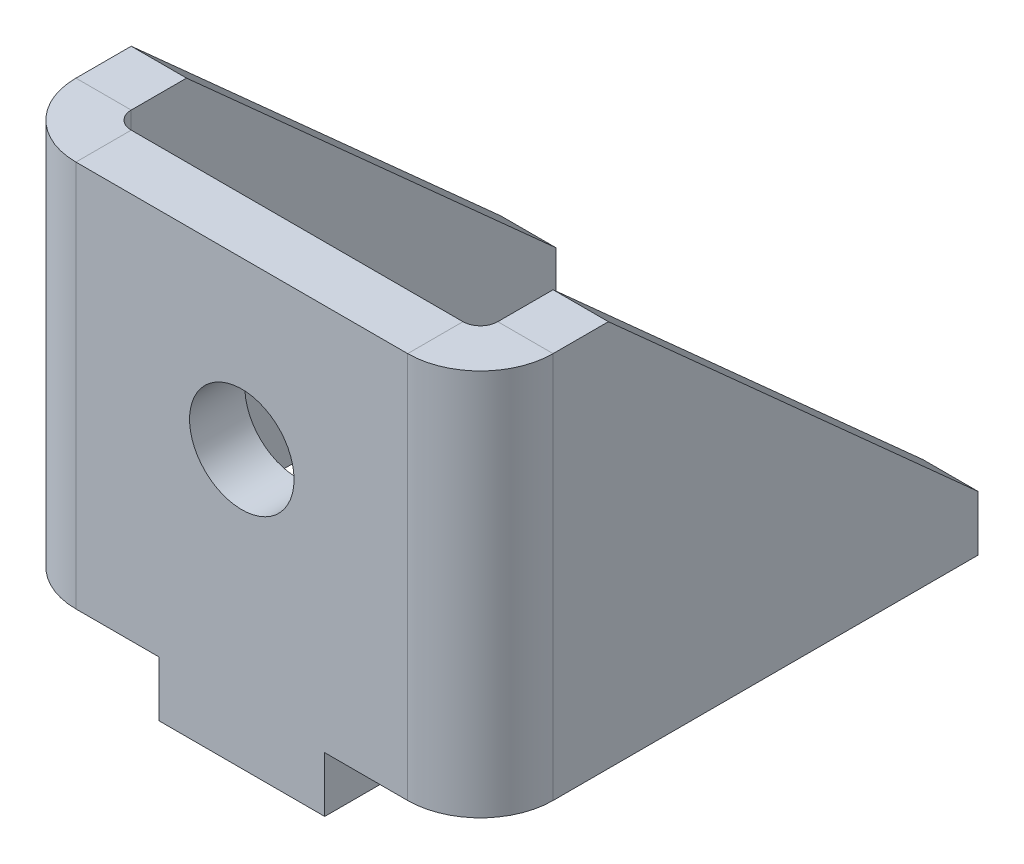
ISO-10303-21;
HEADER;
FILE_DESCRIPTION(('STEP AP214'),'2;1');
FILE_NAME('part.step','',(''),(''),'','','');
FILE_SCHEMA(('AUTOMOTIVE_DESIGN { 1 0 10303 214 1 1 1 1 }'));
ENDSEC;
DATA;
#1=APPLICATION_CONTEXT('core data for automotive mechanical design processes');
#2=APPLICATION_PROTOCOL_DEFINITION('international standard','automotive_design',2000,#1);
#3=PRODUCT_CONTEXT('',#1,'mechanical');
#4=PRODUCT('Part','Part','',(#3));
#5=PRODUCT_RELATED_PRODUCT_CATEGORY('part','',(#4));
#6=PRODUCT_DEFINITION_FORMATION('','',#4);
#7=PRODUCT_DEFINITION_CONTEXT('part definition',#1,'design');
#8=PRODUCT_DEFINITION('design','',#6,#7);
#9=PRODUCT_DEFINITION_SHAPE('','',#8);
#10=(LENGTH_UNIT() NAMED_UNIT(*) SI_UNIT(.MILLI.,.METRE.));
#11=(NAMED_UNIT(*) PLANE_ANGLE_UNIT() SI_UNIT($,.RADIAN.));
#12=(NAMED_UNIT(*) SI_UNIT($,.STERADIAN.) SOLID_ANGLE_UNIT());
#13=UNCERTAINTY_MEASURE_WITH_UNIT(LENGTH_MEASURE(1.E-05),#10,'distance_accuracy_value','');
#14=(GEOMETRIC_REPRESENTATION_CONTEXT(3) GLOBAL_UNCERTAINTY_ASSIGNED_CONTEXT((#13)) GLOBAL_UNIT_ASSIGNED_CONTEXT((#10,
#11,#12)) REPRESENTATION_CONTEXT('',''));
#15=CARTESIAN_POINT('',(0.,0.,0.));
#16=DIRECTION('',(0.,0.,1.));
#17=DIRECTION('',(1.,0.,0.));
#18=AXIS2_PLACEMENT_3D('',#15,#16,#17);
#19=CARTESIAN_POINT('',(-9.525,-11.1125,-3.175));
#20=DIRECTION('',(0.,-1.,0.));
#21=DIRECTION('',(0.,0.,-1.));
#22=AXIS2_PLACEMENT_3D('',#19,#20,#21);
#23=PLANE('',#22);
#24=DIRECTION('',(1.,0.,0.));
#25=VECTOR('',#24,1.);
#26=CARTESIAN_POINT('',(-9.525,-11.1125,-3.175));
#27=LINE('',#26,#25);
#28=CARTESIAN_POINT('',(-9.525,-11.1125,-3.175));
#29=VERTEX_POINT('',#28);
#30=CARTESIAN_POINT('',(-4.7625,-11.1125,-3.175));
#31=VERTEX_POINT('',#30);
#32=EDGE_CURVE('E354',#29,#31,#27,.T.);
#33=ORIENTED_EDGE('',*,*,#32,.T.);
#34=DIRECTION('',(0.,0.,-1.));
#35=VECTOR('',#34,1.);
#36=CARTESIAN_POINT('',(-4.7625,-11.1125,0.));
#37=LINE('',#36,#35);
#38=CARTESIAN_POINT('',(-4.7625,-11.1125,0.));
#39=VERTEX_POINT('',#38);
#40=EDGE_CURVE('E232',#39,#31,#37,.T.);
#41=ORIENTED_EDGE('',*,*,#40,.F.);
#42=DIRECTION('',(1.,0.,0.));
#43=VECTOR('',#42,1.);
#44=CARTESIAN_POINT('',(-9.525,-11.1125,0.));
#45=LINE('',#44,#43);
#46=CARTESIAN_POINT('',(-9.525,-11.1125,0.));
#47=VERTEX_POINT('',#46);
#48=EDGE_CURVE('E348',#47,#39,#45,.T.);
#49=ORIENTED_EDGE('',*,*,#48,.F.);
#50=DIRECTION('',(0.,0.,1.));
#51=VECTOR('',#50,1.);
#52=CARTESIAN_POINT('',(-9.525,-11.1125,-3.175));
#53=LINE('',#52,#51);
#54=EDGE_CURVE('E94',#29,#47,#53,.T.);
#55=ORIENTED_EDGE('',*,*,#54,.F.);
#56=EDGE_LOOP('',(#33,#41,#49,#55));
#57=FACE_BOUND('',#56,.T.);
#58=ADVANCED_FACE('F85',(#57),#23,.T.);
#59=DIRECTION('',(0.,0.,-1.));
#60=VECTOR('',#59,1.);
#61=CARTESIAN_POINT('',(4.7625,-11.1125,0.));
#62=LINE('',#61,#60);
#63=CARTESIAN_POINT('',(4.7625,-11.1125,0.));
#64=VERTEX_POINT('',#63);
#65=CARTESIAN_POINT('',(4.7625,-11.1125,-3.175));
#66=VERTEX_POINT('',#65);
#67=EDGE_CURVE('E102',#64,#66,#62,.T.);
#68=ORIENTED_EDGE('',*,*,#67,.T.);
#69=CARTESIAN_POINT('',(9.525,-11.1125,-3.175));
#70=VERTEX_POINT('',#69);
#71=EDGE_CURVE('E353',#66,#70,#27,.T.);
#72=ORIENTED_EDGE('',*,*,#71,.T.);
#73=DIRECTION('',(0.,0.,1.));
#74=VECTOR('',#73,1.);
#75=CARTESIAN_POINT('',(9.525,-11.1125,-3.175));
#76=LINE('',#75,#74);
#77=CARTESIAN_POINT('',(9.52500000000001,-11.1125,0.));
#78=VERTEX_POINT('',#77);
#79=EDGE_CURVE('E13',#70,#78,#76,.T.);
#80=ORIENTED_EDGE('',*,*,#79,.T.);
#81=EDGE_CURVE('E364',#64,#78,#45,.T.);
#82=ORIENTED_EDGE('',*,*,#81,.F.);
#83=EDGE_LOOP('',(#68,#72,#80,#82));
#84=FACE_BOUND('',#83,.T.);
#85=ADVANCED_FACE('F388',(#84),#23,.T.);
#86=CARTESIAN_POINT('',(-9.525,11.1125,-3.175));
#87=DIRECTION('',(0.,1.,0.));
#88=DIRECTION('',(-1.,0.,0.));
#89=AXIS2_PLACEMENT_3D('',#86,#87,#88);
#90=PLANE('',#89);
#91=DIRECTION('',(-1.,0.,0.));
#92=VECTOR('',#91,1.);
#93=CARTESIAN_POINT('',(-9.525,11.1125,0.));
#94=LINE('',#93,#92);
#95=CARTESIAN_POINT('',(9.525,11.1125,0.));
#96=VERTEX_POINT('',#95);
#97=CARTESIAN_POINT('',(-9.525,11.1125,0.));
#98=VERTEX_POINT('',#97);
#99=EDGE_CURVE('E358',#96,#98,#94,.T.);
#100=ORIENTED_EDGE('',*,*,#99,.F.);
#101=DIRECTION('',(0.,0.,1.));
#102=VECTOR('',#101,1.);
#103=CARTESIAN_POINT('',(9.525,11.1125,-3.175));
#104=LINE('',#103,#102);
#105=CARTESIAN_POINT('',(9.525,11.1125,-3.175));
#106=VERTEX_POINT('',#105);
#107=EDGE_CURVE('E89',#106,#96,#104,.T.);
#108=ORIENTED_EDGE('',*,*,#107,.F.);
#109=DIRECTION('',(-1.,0.,0.));
#110=VECTOR('',#109,1.);
#111=CARTESIAN_POINT('',(-9.525,11.1125,-3.175));
#112=LINE('',#111,#110);
#113=CARTESIAN_POINT('',(-9.525,11.1125,-3.175));
#114=VERTEX_POINT('',#113);
#115=EDGE_CURVE('E347',#106,#114,#112,.T.);
#116=ORIENTED_EDGE('',*,*,#115,.T.);
#117=DIRECTION('',(0.,0.,1.));
#118=VECTOR('',#117,1.);
#119=CARTESIAN_POINT('',(-9.525,11.1125,-3.175));
#120=LINE('',#119,#118);
#121=EDGE_CURVE('E367',#114,#98,#120,.T.);
#122=ORIENTED_EDGE('',*,*,#121,.T.);
#123=EDGE_LOOP('',(#100,#108,#116,#122));
#124=FACE_BOUND('',#123,.T.);
#125=ADVANCED_FACE('F87',(#124),#90,.T.);
#126=CARTESIAN_POINT('',(0.,0.,-3.175));
#127=DIRECTION('',(0.,0.,1.));
#128=DIRECTION('',(1.,0.,0.));
#129=AXIS2_PLACEMENT_3D('',#126,#127,#128);
#130=PLANE('',#129);
#131=CARTESIAN_POINT('',(0.,1.58749999999999,-3.175));
#132=DIRECTION('',(0.,0.,1.));
#133=DIRECTION('',(1.,0.,0.));
#134=AXIS2_PLACEMENT_3D('',#131,#132,#133);
#135=CIRCLE('',#134,3.);
#136=CARTESIAN_POINT('',(3.00000000000001,1.58749999999999,-3.175));
#137=VERTEX_POINT('',#136);
#138=EDGE_CURVE('E236',#137,#137,#135,.T.);
#139=ORIENTED_EDGE('',*,*,#138,.T.);
#140=EDGE_LOOP('',(#139));
#141=FACE_BOUND('',#140,.T.);
#142=DIRECTION('',(0.,1.,0.));
#143=VECTOR('',#142,1.);
#144=CARTESIAN_POINT('',(9.525,11.1125,-3.175));
#145=LINE('',#144,#143);
#146=EDGE_CURVE('E345',#70,#106,#145,.T.);
#147=ORIENTED_EDGE('',*,*,#146,.F.);
#148=ORIENTED_EDGE('',*,*,#71,.F.);
#149=DIRECTION('',(0.,1.,0.));
#150=VECTOR('',#149,1.);
#151=CARTESIAN_POINT('',(4.7625,-14.2875,-3.175));
#152=LINE('',#151,#150);
#153=CARTESIAN_POINT('',(4.7625,-14.2875,-3.175));
#154=VERTEX_POINT('',#153);
#155=EDGE_CURVE('E241',#154,#66,#152,.T.);
#156=ORIENTED_EDGE('',*,*,#155,.F.);
#157=DIRECTION('',(1.,0.,0.));
#158=VECTOR('',#157,1.);
#159=CARTESIAN_POINT('',(0.,-14.2875,-3.175));
#160=LINE('',#159,#158);
#161=CARTESIAN_POINT('',(-4.7625,-14.2875,-3.175));
#162=VERTEX_POINT('',#161);
#163=EDGE_CURVE('E230',#162,#154,#160,.T.);
#164=ORIENTED_EDGE('',*,*,#163,.F.);
#165=DIRECTION('',(0.,1.,0.));
#166=VECTOR('',#165,1.);
#167=CARTESIAN_POINT('',(-4.7625,-14.2875,-3.175));
#168=LINE('',#167,#166);
#169=EDGE_CURVE('E244',#162,#31,#168,.T.);
#170=ORIENTED_EDGE('',*,*,#169,.T.);
#171=ORIENTED_EDGE('',*,*,#32,.F.);
#172=DIRECTION('',(0.,-1.,0.));
#173=VECTOR('',#172,1.);
#174=CARTESIAN_POINT('',(-9.525,11.1125,-3.175));
#175=LINE('',#174,#173);
#176=EDGE_CURVE('E351',#114,#29,#175,.T.);
#177=ORIENTED_EDGE('',*,*,#176,.F.);
#178=ORIENTED_EDGE('',*,*,#115,.F.);
#179=EDGE_LOOP('',(#147,#148,#156,#164,#170,#171,#177,#178));
#180=FACE_BOUND('',#179,.T.);
#181=ADVANCED_FACE('F392',(#141,#180),#130,.F.);
#182=CARTESIAN_POINT('',(0.,0.,0.));
#183=DIRECTION('',(0.,0.,1.));
#184=DIRECTION('',(1.,0.,0.));
#185=AXIS2_PLACEMENT_3D('',#182,#183,#184);
#186=PLANE('',#185);
#187=CARTESIAN_POINT('',(0.,1.58749999999999,0.));
#188=DIRECTION('',(0.,0.,1.));
#189=DIRECTION('',(1.,0.,0.));
#190=AXIS2_PLACEMENT_3D('',#187,#188,#189);
#191=CIRCLE('',#190,3.);
#192=CARTESIAN_POINT('',(3.00000000000001,1.58749999999999,0.));
#193=VERTEX_POINT('',#192);
#194=EDGE_CURVE('E529',#193,#193,#191,.T.);
#195=ORIENTED_EDGE('',*,*,#194,.F.);
#196=EDGE_LOOP('',(#195));
#197=FACE_BOUND('',#196,.T.);
#198=DIRECTION('',(0.,1.,0.));
#199=VECTOR('',#198,1.);
#200=CARTESIAN_POINT('',(9.525,11.1125,0.));
#201=LINE('',#200,#199);
#202=EDGE_CURVE('E336',#78,#96,#201,.T.);
#203=ORIENTED_EDGE('',*,*,#202,.T.);
#204=ORIENTED_EDGE('',*,*,#99,.T.);
#205=DIRECTION('',(0.,-1.,0.));
#206=VECTOR('',#205,1.);
#207=CARTESIAN_POINT('',(-9.525,11.1125,0.));
#208=LINE('',#207,#206);
#209=EDGE_CURVE('E361',#98,#47,#208,.T.);
#210=ORIENTED_EDGE('',*,*,#209,.T.);
#211=ORIENTED_EDGE('',*,*,#48,.T.);
#212=DIRECTION('',(0.,1.,0.));
#213=VECTOR('',#212,1.);
#214=CARTESIAN_POINT('',(-4.7625,-14.2875,0.));
#215=LINE('',#214,#213);
#216=CARTESIAN_POINT('',(-4.7625,-14.2875,0.));
#217=VERTEX_POINT('',#216);
#218=EDGE_CURVE('E217',#217,#39,#215,.T.);
#219=ORIENTED_EDGE('',*,*,#218,.F.);
#220=DIRECTION('',(-1.,0.,0.));
#221=VECTOR('',#220,1.);
#222=CARTESIAN_POINT('',(0.,-14.2875,0.));
#223=LINE('',#222,#221);
#224=CARTESIAN_POINT('',(4.7625,-14.2875,0.));
#225=VERTEX_POINT('',#224);
#226=EDGE_CURVE('E220',#225,#217,#223,.T.);
#227=ORIENTED_EDGE('',*,*,#226,.F.);
#228=DIRECTION('',(0.,1.,0.));
#229=VECTOR('',#228,1.);
#230=CARTESIAN_POINT('',(4.7625,-14.2875,0.));
#231=LINE('',#230,#229);
#232=EDGE_CURVE('E210',#225,#64,#231,.T.);
#233=ORIENTED_EDGE('',*,*,#232,.T.);
#234=ORIENTED_EDGE('',*,*,#81,.T.);
#235=EDGE_LOOP('',(#203,#204,#210,#211,#219,#227,#233,#234));
#236=FACE_BOUND('',#235,.T.);
#237=ADVANCED_FACE('F222',(#197,#236),#186,.T.);
#238=CARTESIAN_POINT('',(9.525,11.1125,-4.175));
#239=DIRECTION('',(0.,1.,0.));
#240=DIRECTION('',(0.,0.,1.));
#241=AXIS2_PLACEMENT_3D('',#238,#239,#240);
#242=PLANE('',#241);
#243=DIRECTION('',(-1.,0.,0.));
#244=VECTOR('',#243,1.);
#245=CARTESIAN_POINT('',(13.7,11.1125,-4.17499999999999));
#246=LINE('',#245,#244);
#247=CARTESIAN_POINT('',(10.525,11.1125,-4.175));
#248=VERTEX_POINT('',#247);
#249=CARTESIAN_POINT('',(13.7,11.1125,-4.17499999999998));
#250=VERTEX_POINT('',#249);
#251=EDGE_CURVE('E296',#248,#250,#246,.F.);
#252=ORIENTED_EDGE('',*,*,#251,.F.);
#253=CARTESIAN_POINT('',(9.525,11.1125,-4.175));
#254=DIRECTION('',(0.,-1.,0.));
#255=DIRECTION('',(0.,0.,-1.));
#256=AXIS2_PLACEMENT_3D('',#253,#254,#255);
#257=CIRCLE('',#256,1.);
#258=EDGE_CURVE('E340',#106,#248,#257,.F.);
#259=ORIENTED_EDGE('',*,*,#258,.F.);
#260=ORIENTED_EDGE('',*,*,#107,.T.);
#261=CARTESIAN_POINT('',(9.525,11.1125,-4.175));
#262=DIRECTION('',(0.,-1.,0.));
#263=DIRECTION('',(0.,0.,-1.));
#264=AXIS2_PLACEMENT_3D('',#261,#262,#263);
#265=CIRCLE('',#264,4.175);
#266=EDGE_CURVE('E333',#96,#250,#265,.F.);
#267=ORIENTED_EDGE('',*,*,#266,.T.);
#268=EDGE_LOOP('',(#252,#259,#260,#267));
#269=FACE_BOUND('',#268,.T.);
#270=ADVANCED_FACE('F376',(#269),#242,.T.);
#271=CARTESIAN_POINT('',(9.525,-11.1125,-4.175));
#272=DIRECTION('',(0.,1.,0.));
#273=DIRECTION('',(0.,0.,1.));
#274=AXIS2_PLACEMENT_3D('',#271,#272,#273);
#275=PLANE('',#274);
#276=CARTESIAN_POINT('',(9.525,-11.1125,-4.175));
#277=DIRECTION('',(0.,-1.,0.));
#278=DIRECTION('',(0.,0.,-1.));
#279=AXIS2_PLACEMENT_3D('',#276,#277,#278);
#280=CIRCLE('',#279,1.);
#281=CARTESIAN_POINT('',(10.525,-11.1125,-4.175));
#282=VERTEX_POINT('',#281);
#283=EDGE_CURVE('E308',#282,#70,#280,.T.);
#284=ORIENTED_EDGE('',*,*,#283,.F.);
#285=DIRECTION('',(-1.,0.,0.));
#286=VECTOR('',#285,1.);
#287=CARTESIAN_POINT('',(10.525,-11.1125,-4.175));
#288=LINE('',#287,#286);
#289=CARTESIAN_POINT('',(13.7,-11.1125,-4.17499999999999));
#290=VERTEX_POINT('',#289);
#291=EDGE_CURVE('E326',#282,#290,#288,.F.);
#292=ORIENTED_EDGE('',*,*,#291,.T.);
#293=CARTESIAN_POINT('',(9.525,-11.1125,-4.175));
#294=DIRECTION('',(0.,-1.,0.));
#295=DIRECTION('',(0.,0.,-1.));
#296=AXIS2_PLACEMENT_3D('',#293,#294,#295);
#297=CIRCLE('',#296,4.175);
#298=EDGE_CURVE('E337',#290,#78,#297,.T.);
#299=ORIENTED_EDGE('',*,*,#298,.T.);
#300=ORIENTED_EDGE('',*,*,#79,.F.);
#301=EDGE_LOOP('',(#284,#292,#299,#300));
#302=FACE_BOUND('',#301,.T.);
#303=ADVANCED_FACE('F384',(#302),#275,.F.);
#304=CARTESIAN_POINT('',(9.525,-11.1125,-4.175));
#305=DIRECTION('',(0.,-1.,0.));
#306=DIRECTION('',(1.,0.,0.));
#307=AXIS2_PLACEMENT_3D('',#304,#305,#306);
#308=CYLINDRICAL_SURFACE('',#307,4.175);
#309=ORIENTED_EDGE('',*,*,#202,.F.);
#310=ORIENTED_EDGE('',*,*,#298,.F.);
#311=DIRECTION('',(0.,-1.,0.));
#312=VECTOR('',#311,1.);
#313=CARTESIAN_POINT('',(13.7,11.1125,-4.17499999999999));
#314=LINE('',#313,#312);
#315=EDGE_CURVE('E323',#290,#250,#314,.F.);
#316=ORIENTED_EDGE('',*,*,#315,.T.);
#317=ORIENTED_EDGE('',*,*,#266,.F.);
#318=EDGE_LOOP('',(#309,#310,#316,#317));
#319=FACE_BOUND('',#318,.T.);
#320=ADVANCED_FACE('F380',(#319),#308,.T.);
#321=CARTESIAN_POINT('',(9.525,-11.1125,-4.175));
#322=DIRECTION('',(0.,-1.,0.));
#323=DIRECTION('',(1.,0.,0.));
#324=AXIS2_PLACEMENT_3D('',#321,#322,#323);
#325=CYLINDRICAL_SURFACE('',#324,1.);
#326=ORIENTED_EDGE('',*,*,#146,.T.);
#327=ORIENTED_EDGE('',*,*,#258,.T.);
#328=DIRECTION('',(0.,-1.,0.));
#329=VECTOR('',#328,1.);
#330=CARTESIAN_POINT('',(10.525,11.1125,-4.175));
#331=LINE('',#330,#329);
#332=EDGE_CURVE('E329',#248,#282,#331,.T.);
#333=ORIENTED_EDGE('',*,*,#332,.T.);
#334=ORIENTED_EDGE('',*,*,#283,.T.);
#335=EDGE_LOOP('',(#326,#327,#333,#334));
#336=FACE_BOUND('',#335,.T.);
#337=ADVANCED_FACE('F395',(#336),#325,.F.);
#338=CARTESIAN_POINT('',(13.7000000000001,-11.1125,-28.575));
#339=DIRECTION('',(0.,1.,0.));
#340=DIRECTION('',(-1.,0.,0.));
#341=AXIS2_PLACEMENT_3D('',#338,#339,#340);
#342=PLANE('',#341);
#343=ORIENTED_EDGE('',*,*,#291,.F.);
#344=DIRECTION('',(0.,0.,1.));
#345=VECTOR('',#344,1.);
#346=CARTESIAN_POINT('',(10.5250000000001,-11.1125,-28.575));
#347=LINE('',#346,#345);
#348=CARTESIAN_POINT('',(10.5250000000001,-11.1125,-28.575));
#349=VERTEX_POINT('',#348);
#350=EDGE_CURVE('E321',#282,#349,#347,.F.);
#351=ORIENTED_EDGE('',*,*,#350,.T.);
#352=DIRECTION('',(-1.,0.,0.));
#353=VECTOR('',#352,1.);
#354=CARTESIAN_POINT('',(13.7000000000001,-11.1125,-28.575));
#355=LINE('',#354,#353);
#356=CARTESIAN_POINT('',(13.7000000000001,-11.1125,-28.575));
#357=VERTEX_POINT('',#356);
#358=EDGE_CURVE('E305',#357,#349,#355,.T.);
#359=ORIENTED_EDGE('',*,*,#358,.F.);
#360=DIRECTION('',(0.,0.,-1.));
#361=VECTOR('',#360,1.);
#362=CARTESIAN_POINT('',(13.7,-11.1125,0.));
#363=LINE('',#362,#361);
#364=EDGE_CURVE('E314',#290,#357,#363,.T.);
#365=ORIENTED_EDGE('',*,*,#364,.F.);
#366=EDGE_LOOP('',(#343,#351,#359,#365));
#367=FACE_BOUND('',#366,.T.);
#368=ADVANCED_FACE('F400',(#367),#342,.F.);
#369=CARTESIAN_POINT('',(13.7,11.1125,-3.17499999999999));
#370=DIRECTION('',(0.,-1.,0.));
#371=DIRECTION('',(1.,0.,0.));
#372=AXIS2_PLACEMENT_3D('',#369,#370,#371);
#373=PLANE('',#372);
#374=DIRECTION('',(0.,0.,1.));
#375=VECTOR('',#374,1.);
#376=CARTESIAN_POINT('',(13.7,11.1125,0.));
#377=LINE('',#376,#375);
#378=CARTESIAN_POINT('',(13.7,11.1125,-7.34999999999999));
#379=VERTEX_POINT('',#378);
#380=EDGE_CURVE('E309',#379,#250,#377,.T.);
#381=ORIENTED_EDGE('',*,*,#380,.F.);
#382=DIRECTION('',(1.,0.,0.));
#383=VECTOR('',#382,1.);
#384=CARTESIAN_POINT('',(-13.7000000000002,11.1125,-7.35000000000008));
#385=LINE('',#384,#383);
#386=CARTESIAN_POINT('',(10.5250000000001,11.1125,-7.35));
#387=VERTEX_POINT('',#386);
#388=EDGE_CURVE('E251',#387,#379,#385,.T.);
#389=ORIENTED_EDGE('',*,*,#388,.F.);
#390=DIRECTION('',(0.,0.,-1.));
#391=VECTOR('',#390,1.);
#392=CARTESIAN_POINT('',(10.525,11.1125,-3.175));
#393=LINE('',#392,#391);
#394=EDGE_CURVE('E316',#387,#248,#393,.F.);
#395=ORIENTED_EDGE('',*,*,#394,.T.);
#396=ORIENTED_EDGE('',*,*,#251,.T.);
#397=EDGE_LOOP('',(#381,#389,#395,#396));
#398=FACE_BOUND('',#397,.T.);
#399=ADVANCED_FACE('F415',(#398),#373,.F.);
#400=CARTESIAN_POINT('',(13.7,0.,0.));
#401=DIRECTION('',(-1.,0.,0.));
#402=DIRECTION('',(0.,0.,1.));
#403=AXIS2_PLACEMENT_3D('',#400,#401,#402);
#404=PLANE('',#403);
#405=DIRECTION('',(0.,1.,0.));
#406=VECTOR('',#405,1.);
#407=CARTESIAN_POINT('',(13.7000000000001,0.,-28.575));
#408=LINE('',#407,#406);
#409=CARTESIAN_POINT('',(13.7000000000001,-7.9375,-28.575));
#410=VERTEX_POINT('',#409);
#411=EDGE_CURVE('E311',#357,#410,#408,.T.);
#412=ORIENTED_EDGE('',*,*,#411,.T.);
#413=DIRECTION('',(0.,-0.66794708937217,-0.74420876493041));
#414=VECTOR('',#413,1.);
#415=CARTESIAN_POINT('',(13.7,9.808248072335,-8.80316258082358));
#416=LINE('',#415,#414);
#417=EDGE_CURVE('E110',#379,#410,#416,.T.);
#418=ORIENTED_EDGE('',*,*,#417,.F.);
#419=ORIENTED_EDGE('',*,*,#380,.T.);
#420=ORIENTED_EDGE('',*,*,#315,.F.);
#421=ORIENTED_EDGE('',*,*,#364,.T.);
#422=EDGE_LOOP('',(#412,#418,#419,#420,#421));
#423=FACE_BOUND('',#422,.T.);
#424=ADVANCED_FACE('F411',(#423),#404,.F.);
#425=CARTESIAN_POINT('',(10.525,0.,0.));
#426=DIRECTION('',(-1.,0.,0.));
#427=DIRECTION('',(0.,0.,1.));
#428=AXIS2_PLACEMENT_3D('',#425,#426,#427);
#429=PLANE('',#428);
#430=DIRECTION('',(0.,0.66794708937217,0.74420876493041));
#431=VECTOR('',#430,1.);
#432=CARTESIAN_POINT('',(10.525,9.80824807233499,-8.8031625808236));
#433=LINE('',#432,#431);
#434=CARTESIAN_POINT('',(10.5250000000001,-7.9375,-28.575));
#435=VERTEX_POINT('',#434);
#436=EDGE_CURVE('E261',#435,#387,#433,.T.);
#437=ORIENTED_EDGE('',*,*,#436,.F.);
#438=DIRECTION('',(0.,-1.,0.));
#439=VECTOR('',#438,1.);
#440=CARTESIAN_POINT('',(10.5250000000001,11.1125,-28.575));
#441=LINE('',#440,#439);
#442=EDGE_CURVE('E318',#349,#435,#441,.F.);
#443=ORIENTED_EDGE('',*,*,#442,.F.);
#444=ORIENTED_EDGE('',*,*,#350,.F.);
#445=ORIENTED_EDGE('',*,*,#332,.F.);
#446=ORIENTED_EDGE('',*,*,#394,.F.);
#447=EDGE_LOOP('',(#437,#443,#444,#445,#446));
#448=FACE_BOUND('',#447,.T.);
#449=ADVANCED_FACE('F405',(#448),#429,.T.);
#450=CARTESIAN_POINT('',(13.7000000000001,11.1125,-28.575));
#451=DIRECTION('',(0.,0.,1.));
#452=DIRECTION('',(1.,0.,0.));
#453=AXIS2_PLACEMENT_3D('',#450,#451,#452);
#454=PLANE('',#453);
#455=ORIENTED_EDGE('',*,*,#442,.T.);
#456=DIRECTION('',(1.,0.,0.));
#457=VECTOR('',#456,1.);
#458=CARTESIAN_POINT('',(-13.7000000000001,-7.93750000000001,-28.5750000000001));
#459=LINE('',#458,#457);
#460=EDGE_CURVE('E257',#435,#410,#459,.T.);
#461=ORIENTED_EDGE('',*,*,#460,.T.);
#462=ORIENTED_EDGE('',*,*,#411,.F.);
#463=ORIENTED_EDGE('',*,*,#358,.T.);
#464=EDGE_LOOP('',(#455,#461,#462,#463));
#465=FACE_BOUND('',#464,.T.);
#466=ADVANCED_FACE('F408',(#465),#454,.F.);
#467=CARTESIAN_POINT('',(-9.525,-11.1125,-4.175));
#468=DIRECTION('',(0.,-1.,0.));
#469=DIRECTION('',(0.,0.,-1.));
#470=AXIS2_PLACEMENT_3D('',#467,#468,#469);
#471=PLANE('',#470);
#472=DIRECTION('',(1.,0.,0.));
#473=VECTOR('',#472,1.);
#474=CARTESIAN_POINT('',(-13.7,-11.1125,-4.17499999999999));
#475=LINE('',#474,#473);
#476=CARTESIAN_POINT('',(-10.525,-11.1125,-4.175));
#477=VERTEX_POINT('',#476);
#478=CARTESIAN_POINT('',(-13.7,-11.1125,-4.17499999999998));
#479=VERTEX_POINT('',#478);
#480=EDGE_CURVE('E263',#477,#479,#475,.F.);
#481=ORIENTED_EDGE('',*,*,#480,.F.);
#482=CARTESIAN_POINT('',(-9.525,-11.1125,-4.175));
#483=DIRECTION('',(0.,1.,0.));
#484=DIRECTION('',(0.,0.,1.));
#485=AXIS2_PLACEMENT_3D('',#482,#483,#484);
#486=CIRCLE('',#485,1.);
#487=EDGE_CURVE('E300',#29,#477,#486,.F.);
#488=ORIENTED_EDGE('',*,*,#487,.F.);
#489=ORIENTED_EDGE('',*,*,#54,.T.);
#490=CARTESIAN_POINT('',(-9.525,-11.1125,-4.175));
#491=DIRECTION('',(0.,1.,0.));
#492=DIRECTION('',(0.,0.,1.));
#493=AXIS2_PLACEMENT_3D('',#490,#491,#492);
#494=CIRCLE('',#493,4.175);
#495=EDGE_CURVE('E293',#47,#479,#494,.F.);
#496=ORIENTED_EDGE('',*,*,#495,.T.);
#497=EDGE_LOOP('',(#481,#488,#489,#496));
#498=FACE_BOUND('',#497,.T.);
#499=ADVANCED_FACE('F453',(#498),#471,.T.);
#500=CARTESIAN_POINT('',(-9.525,11.1125,-4.175));
#501=DIRECTION('',(0.,-1.,0.));
#502=DIRECTION('',(0.,0.,-1.));
#503=AXIS2_PLACEMENT_3D('',#500,#501,#502);
#504=PLANE('',#503);
#505=CARTESIAN_POINT('',(-9.525,11.1125,-4.175));
#506=DIRECTION('',(0.,1.,0.));
#507=DIRECTION('',(0.,0.,1.));
#508=AXIS2_PLACEMENT_3D('',#505,#506,#507);
#509=CIRCLE('',#508,1.);
#510=CARTESIAN_POINT('',(-10.525,11.1125,-4.175));
#511=VERTEX_POINT('',#510);
#512=EDGE_CURVE('E267',#511,#114,#509,.T.);
#513=ORIENTED_EDGE('',*,*,#512,.F.);
#514=DIRECTION('',(1.,0.,0.));
#515=VECTOR('',#514,1.);
#516=CARTESIAN_POINT('',(-10.525,11.1125,-4.175));
#517=LINE('',#516,#515);
#518=CARTESIAN_POINT('',(-13.7,11.1125,-4.17499999999999));
#519=VERTEX_POINT('',#518);
#520=EDGE_CURVE('E286',#511,#519,#517,.F.);
#521=ORIENTED_EDGE('',*,*,#520,.T.);
#522=CARTESIAN_POINT('',(-9.525,11.1125,-4.175));
#523=DIRECTION('',(0.,1.,0.));
#524=DIRECTION('',(0.,0.,1.));
#525=AXIS2_PLACEMENT_3D('',#522,#523,#524);
#526=CIRCLE('',#525,4.175);
#527=EDGE_CURVE('E297',#519,#98,#526,.T.);
#528=ORIENTED_EDGE('',*,*,#527,.T.);
#529=ORIENTED_EDGE('',*,*,#121,.F.);
#530=EDGE_LOOP('',(#513,#521,#528,#529));
#531=FACE_BOUND('',#530,.T.);
#532=ADVANCED_FACE('F460',(#531),#504,.F.);
#533=CARTESIAN_POINT('',(-9.525,11.1125,-4.175));
#534=DIRECTION('',(0.,1.,0.));
#535=DIRECTION('',(-1.,0.,0.));
#536=AXIS2_PLACEMENT_3D('',#533,#534,#535);
#537=CYLINDRICAL_SURFACE('',#536,4.175);
#538=ORIENTED_EDGE('',*,*,#209,.F.);
#539=ORIENTED_EDGE('',*,*,#527,.F.);
#540=DIRECTION('',(0.,1.,0.));
#541=VECTOR('',#540,1.);
#542=CARTESIAN_POINT('',(-13.7,-11.1125,-4.17499999999999));
#543=LINE('',#542,#541);
#544=EDGE_CURVE('E284',#519,#479,#543,.F.);
#545=ORIENTED_EDGE('',*,*,#544,.T.);
#546=ORIENTED_EDGE('',*,*,#495,.F.);
#547=EDGE_LOOP('',(#538,#539,#545,#546));
#548=FACE_BOUND('',#547,.T.);
#549=ADVANCED_FACE('F463',(#548),#537,.T.);
#550=CARTESIAN_POINT('',(-9.525,11.1125,-4.175));
#551=DIRECTION('',(0.,1.,0.));
#552=DIRECTION('',(-1.,0.,0.));
#553=AXIS2_PLACEMENT_3D('',#550,#551,#552);
#554=CYLINDRICAL_SURFACE('',#553,1.);
#555=ORIENTED_EDGE('',*,*,#176,.T.);
#556=ORIENTED_EDGE('',*,*,#487,.T.);
#557=DIRECTION('',(0.,1.,0.));
#558=VECTOR('',#557,1.);
#559=CARTESIAN_POINT('',(-10.525,-11.1125,-4.175));
#560=LINE('',#559,#558);
#561=EDGE_CURVE('E289',#477,#511,#560,.T.);
#562=ORIENTED_EDGE('',*,*,#561,.T.);
#563=ORIENTED_EDGE('',*,*,#512,.T.);
#564=EDGE_LOOP('',(#555,#556,#562,#563));
#565=FACE_BOUND('',#564,.T.);
#566=ADVANCED_FACE('F468',(#565),#554,.F.);
#567=CARTESIAN_POINT('',(-13.7000000000001,11.1125,-28.575));
#568=DIRECTION('',(0.,-1.,0.));
#569=DIRECTION('',(1.,0.,0.));
#570=AXIS2_PLACEMENT_3D('',#567,#568,#569);
#571=PLANE('',#570);
#572=DIRECTION('',(0.,0.,1.));
#573=VECTOR('',#572,1.);
#574=CARTESIAN_POINT('',(-10.5250000000001,11.1125,-28.575));
#575=LINE('',#574,#573);
#576=CARTESIAN_POINT('',(-10.5250000000001,11.1125,-7.35000000000007));
#577=VERTEX_POINT('',#576);
#578=EDGE_CURVE('E281',#511,#577,#575,.F.);
#579=ORIENTED_EDGE('',*,*,#578,.T.);
#580=CARTESIAN_POINT('',(-13.7000000000002,11.1125,-7.35000000000008));
#581=VERTEX_POINT('',#580);
#582=EDGE_CURVE('E258',#581,#577,#385,.T.);
#583=ORIENTED_EDGE('',*,*,#582,.F.);
#584=DIRECTION('',(0.,0.,-1.));
#585=VECTOR('',#584,1.);
#586=CARTESIAN_POINT('',(-13.7,11.1125,0.));
#587=LINE('',#586,#585);
#588=EDGE_CURVE('E273',#519,#581,#587,.T.);
#589=ORIENTED_EDGE('',*,*,#588,.F.);
#590=ORIENTED_EDGE('',*,*,#520,.F.);
#591=EDGE_LOOP('',(#579,#583,#589,#590));
#592=FACE_BOUND('',#591,.T.);
#593=ADVANCED_FACE('F471',(#592),#571,.F.);
#594=CARTESIAN_POINT('',(-13.7,-11.1125,-3.17499999999999));
#595=DIRECTION('',(0.,1.,0.));
#596=DIRECTION('',(-1.,0.,0.));
#597=AXIS2_PLACEMENT_3D('',#594,#595,#596);
#598=PLANE('',#597);
#599=ORIENTED_EDGE('',*,*,#480,.T.);
#600=DIRECTION('',(0.,0.,1.));
#601=VECTOR('',#600,1.);
#602=CARTESIAN_POINT('',(-13.7,-11.1125,0.));
#603=LINE('',#602,#601);
#604=CARTESIAN_POINT('',(-13.7000000000001,-11.1125,-28.575));
#605=VERTEX_POINT('',#604);
#606=EDGE_CURVE('E268',#605,#479,#603,.T.);
#607=ORIENTED_EDGE('',*,*,#606,.F.);
#608=DIRECTION('',(1.,0.,0.));
#609=VECTOR('',#608,1.);
#610=CARTESIAN_POINT('',(-13.7000000000001,-11.1125,-28.575));
#611=LINE('',#610,#609);
#612=CARTESIAN_POINT('',(-10.5250000000001,-11.1125,-28.575));
#613=VERTEX_POINT('',#612);
#614=EDGE_CURVE('E264',#605,#613,#611,.T.);
#615=ORIENTED_EDGE('',*,*,#614,.T.);
#616=DIRECTION('',(0.,0.,-1.));
#617=VECTOR('',#616,1.);
#618=CARTESIAN_POINT('',(-10.525,-11.1125,-3.175));
#619=LINE('',#618,#617);
#620=EDGE_CURVE('E276',#613,#477,#619,.F.);
#621=ORIENTED_EDGE('',*,*,#620,.T.);
#622=EDGE_LOOP('',(#599,#607,#615,#621));
#623=FACE_BOUND('',#622,.T.);
#624=ADVANCED_FACE('F478',(#623),#598,.F.);
#625=CARTESIAN_POINT('',(-13.7,0.,0.));
#626=DIRECTION('',(1.,0.,0.));
#627=DIRECTION('',(0.,0.,-1.));
#628=AXIS2_PLACEMENT_3D('',#625,#626,#627);
#629=PLANE('',#628);
#630=ORIENTED_EDGE('',*,*,#588,.T.);
#631=DIRECTION('',(0.,-0.66794708937217,-0.74420876493041));
#632=VECTOR('',#631,1.);
#633=CARTESIAN_POINT('',(-13.7000000000002,9.80824807233499,-8.80316258082368));
#634=LINE('',#633,#632);
#635=CARTESIAN_POINT('',(-13.7000000000001,-7.93750000000001,-28.5750000000001));
#636=VERTEX_POINT('',#635);
#637=EDGE_CURVE('E248',#581,#636,#634,.T.);
#638=ORIENTED_EDGE('',*,*,#637,.T.);
#639=DIRECTION('',(0.,-1.,0.));
#640=VECTOR('',#639,1.);
#641=CARTESIAN_POINT('',(-13.7000000000001,0.,-28.575));
#642=LINE('',#641,#640);
#643=EDGE_CURVE('E271',#636,#605,#642,.T.);
#644=ORIENTED_EDGE('',*,*,#643,.T.);
#645=ORIENTED_EDGE('',*,*,#606,.T.);
#646=ORIENTED_EDGE('',*,*,#544,.F.);
#647=EDGE_LOOP('',(#630,#638,#644,#645,#646));
#648=FACE_BOUND('',#647,.T.);
#649=ADVANCED_FACE('F486',(#648),#629,.F.);
#650=CARTESIAN_POINT('',(-10.525,0.,0.));
#651=DIRECTION('',(1.,0.,0.));
#652=DIRECTION('',(0.,0.,-1.));
#653=AXIS2_PLACEMENT_3D('',#650,#651,#652);
#654=PLANE('',#653);
#655=DIRECTION('',(0.,-0.66794708937217,-0.74420876493041));
#656=VECTOR('',#655,1.);
#657=CARTESIAN_POINT('',(-10.525,9.80824807233503,-8.80316258082363));
#658=LINE('',#657,#656);
#659=CARTESIAN_POINT('',(-10.5250000000001,-7.93749999999993,-28.575));
#660=VERTEX_POINT('',#659);
#661=EDGE_CURVE('E256',#577,#660,#658,.T.);
#662=ORIENTED_EDGE('',*,*,#661,.F.);
#663=ORIENTED_EDGE('',*,*,#578,.F.);
#664=ORIENTED_EDGE('',*,*,#561,.F.);
#665=ORIENTED_EDGE('',*,*,#620,.F.);
#666=DIRECTION('',(0.,1.,0.));
#667=VECTOR('',#666,1.);
#668=CARTESIAN_POINT('',(-10.5250000000001,-11.1125,-28.575));
#669=LINE('',#668,#667);
#670=EDGE_CURVE('E279',#660,#613,#669,.F.);
#671=ORIENTED_EDGE('',*,*,#670,.F.);
#672=EDGE_LOOP('',(#662,#663,#664,#665,#671));
#673=FACE_BOUND('',#672,.T.);
#674=ADVANCED_FACE('F482',(#673),#654,.T.);
#675=CARTESIAN_POINT('',(-13.7000000000001,-11.1125,-28.575));
#676=DIRECTION('',(0.,0.,1.));
#677=DIRECTION('',(1.,0.,0.));
#678=AXIS2_PLACEMENT_3D('',#675,#676,#677);
#679=PLANE('',#678);
#680=ORIENTED_EDGE('',*,*,#643,.F.);
#681=EDGE_CURVE('E253',#636,#660,#459,.T.);
#682=ORIENTED_EDGE('',*,*,#681,.T.);
#683=ORIENTED_EDGE('',*,*,#670,.T.);
#684=ORIENTED_EDGE('',*,*,#614,.F.);
#685=EDGE_LOOP('',(#680,#682,#683,#684));
#686=FACE_BOUND('',#685,.T.);
#687=ADVANCED_FACE('F427',(#686),#679,.F.);
#688=CARTESIAN_POINT('',(-13.7000000000002,9.80824807233499,-8.80316258082368));
#689=DIRECTION('',(0.,-0.74420876493041,0.66794708937217));
#690=DIRECTION('',(0.,-0.66794708937217,-0.74420876493041));
#691=AXIS2_PLACEMENT_3D('',#688,#689,#690);
#692=PLANE('',#691);
#693=ORIENTED_EDGE('',*,*,#661,.T.);
#694=ORIENTED_EDGE('',*,*,#681,.F.);
#695=ORIENTED_EDGE('',*,*,#637,.F.);
#696=ORIENTED_EDGE('',*,*,#582,.T.);
#697=EDGE_LOOP('',(#693,#694,#695,#696));
#698=FACE_BOUND('',#697,.T.);
#699=ADVANCED_FACE('F418',(#698),#692,.F.);
#700=ORIENTED_EDGE('',*,*,#436,.T.);
#701=ORIENTED_EDGE('',*,*,#388,.T.);
#702=ORIENTED_EDGE('',*,*,#417,.T.);
#703=ORIENTED_EDGE('',*,*,#460,.F.);
#704=EDGE_LOOP('',(#700,#701,#702,#703));
#705=FACE_BOUND('',#704,.T.);
#706=ADVANCED_FACE('F416',(#705),#692,.F.);
#707=CARTESIAN_POINT('',(4.7625,-14.2875,0.));
#708=DIRECTION('',(1.,0.,0.));
#709=DIRECTION('',(0.,0.,-1.));
#710=AXIS2_PLACEMENT_3D('',#707,#708,#709);
#711=PLANE('',#710);
#712=ORIENTED_EDGE('',*,*,#67,.F.);
#713=ORIENTED_EDGE('',*,*,#232,.F.);
#714=DIRECTION('',(0.,0.,-1.));
#715=VECTOR('',#714,1.);
#716=CARTESIAN_POINT('',(4.7625,-14.2875,0.));
#717=LINE('',#716,#715);
#718=EDGE_CURVE('E214',#225,#154,#717,.T.);
#719=ORIENTED_EDGE('',*,*,#718,.T.);
#720=ORIENTED_EDGE('',*,*,#155,.T.);
#721=EDGE_LOOP('',(#712,#713,#719,#720));
#722=FACE_BOUND('',#721,.T.);
#723=ADVANCED_FACE('F212',(#722),#711,.T.);
#724=CARTESIAN_POINT('',(-4.7625,-14.2875,0.));
#725=DIRECTION('',(1.,0.,0.));
#726=DIRECTION('',(0.,0.,-1.));
#727=AXIS2_PLACEMENT_3D('',#724,#725,#726);
#728=PLANE('',#727);
#729=ORIENTED_EDGE('',*,*,#40,.T.);
#730=ORIENTED_EDGE('',*,*,#169,.F.);
#731=DIRECTION('',(0.,0.,-1.));
#732=VECTOR('',#731,1.);
#733=CARTESIAN_POINT('',(-4.7625,-14.2875,0.));
#734=LINE('',#733,#732);
#735=EDGE_CURVE('E226',#217,#162,#734,.T.);
#736=ORIENTED_EDGE('',*,*,#735,.F.);
#737=ORIENTED_EDGE('',*,*,#218,.T.);
#738=EDGE_LOOP('',(#729,#730,#736,#737));
#739=FACE_BOUND('',#738,.T.);
#740=ADVANCED_FACE('F425',(#739),#728,.F.);
#741=CARTESIAN_POINT('',(0.,-14.2875,0.));
#742=DIRECTION('',(0.,-1.,0.));
#743=DIRECTION('',(0.,0.,-1.));
#744=AXIS2_PLACEMENT_3D('',#741,#742,#743);
#745=PLANE('',#744);
#746=ORIENTED_EDGE('',*,*,#718,.F.);
#747=ORIENTED_EDGE('',*,*,#226,.T.);
#748=ORIENTED_EDGE('',*,*,#735,.T.);
#749=ORIENTED_EDGE('',*,*,#163,.T.);
#750=EDGE_LOOP('',(#746,#747,#748,#749));
#751=FACE_BOUND('',#750,.T.);
#752=ADVANCED_FACE('F228',(#751),#745,.T.);
#753=CARTESIAN_POINT('',(0.,1.58749999999999,-28.5750000000001));
#754=DIRECTION('',(0.,0.,1.));
#755=DIRECTION('',(1.,0.,0.));
#756=AXIS2_PLACEMENT_3D('',#753,#754,#755);
#757=CYLINDRICAL_SURFACE('',#756,3.);
#758=ORIENTED_EDGE('',*,*,#194,.T.);
#759=EDGE_LOOP('',(#758));
#760=FACE_BOUND('',#759,.T.);
#761=ORIENTED_EDGE('',*,*,#138,.F.);
#762=EDGE_LOOP('',(#761));
#763=FACE_BOUND('',#762,.T.);
#764=ADVANCED_FACE('F519',(#760,#763),#757,.F.);
#765=CLOSED_SHELL('',(#58,#85,#125,#181,#237,#270,#303,#320,#337,#368,#399,#424,#449,#466,#499,
#532,#549,#566,#593,#624,#649,#674,#687,#699,#706,#723,#740,#752,#764));
#766=MANIFOLD_SOLID_BREP('B2',#765);
#767=ADVANCED_BREP_SHAPE_REPRESENTATION('',(#18,#766),#14);
#768=SHAPE_DEFINITION_REPRESENTATION(#9,#767);
ENDSEC;
END-ISO-10303-21;
